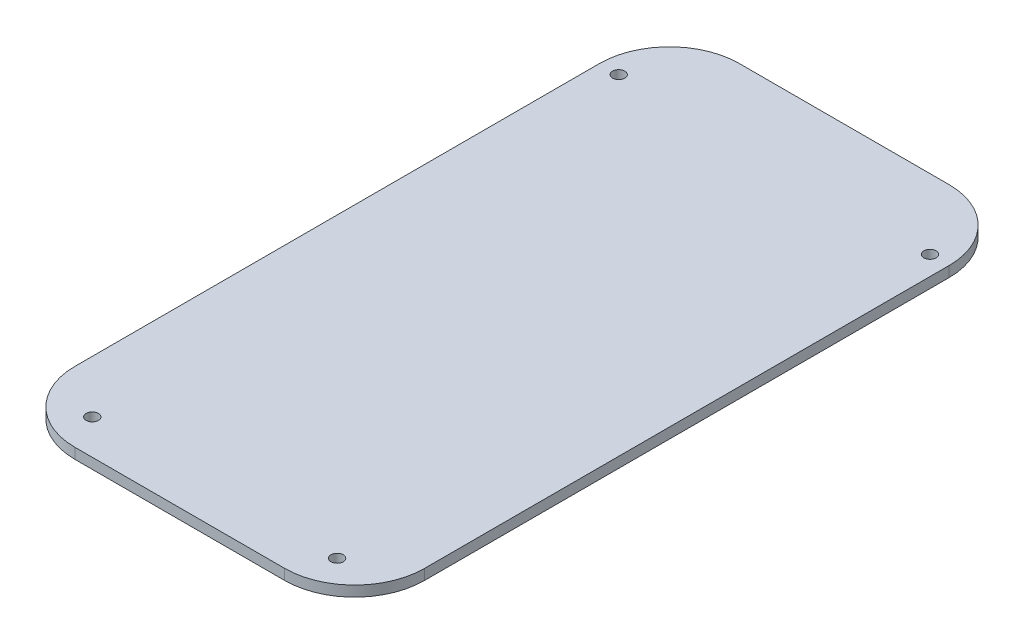
ISO-10303-21;
HEADER;
FILE_DESCRIPTION(('STEP AP214'),'2;1');
FILE_NAME('part.step','',(''),(''),'','','');
FILE_SCHEMA(('AUTOMOTIVE_DESIGN { 1 0 10303 214 1 1 1 1 }'));
ENDSEC;
DATA;
#1=APPLICATION_CONTEXT('core data for automotive mechanical design processes');
#2=APPLICATION_PROTOCOL_DEFINITION('international standard','automotive_design',2000,#1);
#3=PRODUCT_CONTEXT('',#1,'mechanical');
#4=PRODUCT('Part','Part','',(#3));
#5=PRODUCT_RELATED_PRODUCT_CATEGORY('part','',(#4));
#6=PRODUCT_DEFINITION_FORMATION('','',#4);
#7=PRODUCT_DEFINITION_CONTEXT('part definition',#1,'design');
#8=PRODUCT_DEFINITION('design','',#6,#7);
#9=PRODUCT_DEFINITION_SHAPE('','',#8);
#10=(LENGTH_UNIT() NAMED_UNIT(*) SI_UNIT(.MILLI.,.METRE.));
#11=(NAMED_UNIT(*) PLANE_ANGLE_UNIT() SI_UNIT($,.RADIAN.));
#12=(NAMED_UNIT(*) SI_UNIT($,.STERADIAN.) SOLID_ANGLE_UNIT());
#13=UNCERTAINTY_MEASURE_WITH_UNIT(LENGTH_MEASURE(1.E-05),#10,'distance_accuracy_value','');
#14=(GEOMETRIC_REPRESENTATION_CONTEXT(3) GLOBAL_UNCERTAINTY_ASSIGNED_CONTEXT((#13)) GLOBAL_UNIT_ASSIGNED_CONTEXT((#10,
#11,#12)) REPRESENTATION_CONTEXT('',''));
#15=CARTESIAN_POINT('',(0.,0.,0.));
#16=DIRECTION('',(0.,0.,1.));
#17=DIRECTION('',(1.,0.,0.));
#18=AXIS2_PLACEMENT_3D('',#15,#16,#17);
#19=CARTESIAN_POINT('',(20.,3.,-20.));
#20=DIRECTION('',(0.,-1.,0.));
#21=DIRECTION('',(0.,0.,-1.));
#22=AXIS2_PLACEMENT_3D('',#19,#20,#21);
#23=PLANE('',#22);
#24=CARTESIAN_POINT('',(20.,3.,-20.));
#25=DIRECTION('',(0.,1.,0.));
#26=DIRECTION('',(0.,0.,-1.));
#27=AXIS2_PLACEMENT_3D('',#24,#25,#26);
#28=CIRCLE('',#27,20.);
#29=CARTESIAN_POINT('',(0.,3.,-20.0000000000001));
#30=VERTEX_POINT('',#29);
#31=CARTESIAN_POINT('',(20.0000000000001,3.,0.));
#32=VERTEX_POINT('',#31);
#33=EDGE_CURVE('E164',#30,#32,#28,.T.);
#34=ORIENTED_EDGE('',*,*,#33,.T.);
#35=DIRECTION('',(1.,0.,0.));
#36=VECTOR('',#35,1.);
#37=CARTESIAN_POINT('',(20.0000000000001,3.,0.));
#38=LINE('',#37,#36);
#39=CARTESIAN_POINT('',(79.9999999999999,3.,0.));
#40=VERTEX_POINT('',#39);
#41=EDGE_CURVE('E100',#32,#40,#38,.T.);
#42=ORIENTED_EDGE('',*,*,#41,.T.);
#43=CARTESIAN_POINT('',(80.,3.,-20.));
#44=DIRECTION('',(0.,1.,0.));
#45=DIRECTION('',(0.,0.,1.));
#46=AXIS2_PLACEMENT_3D('',#43,#44,#45);
#47=CIRCLE('',#46,20.);
#48=CARTESIAN_POINT('',(100.,3.,-20.0000000000001));
#49=VERTEX_POINT('',#48);
#50=EDGE_CURVE('E185',#40,#49,#47,.T.);
#51=ORIENTED_EDGE('',*,*,#50,.T.);
#52=DIRECTION('',(0.,0.,-1.));
#53=VECTOR('',#52,1.);
#54=CARTESIAN_POINT('',(100.,3.,-20.0000000000001));
#55=LINE('',#54,#53);
#56=CARTESIAN_POINT('',(100.,3.,-170.));
#57=VERTEX_POINT('',#56);
#58=EDGE_CURVE('E199',#49,#57,#55,.T.);
#59=ORIENTED_EDGE('',*,*,#58,.T.);
#60=CARTESIAN_POINT('',(80.,3.,-170.));
#61=DIRECTION('',(0.,1.,0.));
#62=DIRECTION('',(0.,0.,1.));
#63=AXIS2_PLACEMENT_3D('',#60,#61,#62);
#64=CIRCLE('',#63,20.);
#65=CARTESIAN_POINT('',(79.9999999999999,3.,-190.));
#66=VERTEX_POINT('',#65);
#67=EDGE_CURVE('E119',#57,#66,#64,.T.);
#68=ORIENTED_EDGE('',*,*,#67,.T.);
#69=DIRECTION('',(-1.,0.,0.));
#70=VECTOR('',#69,1.);
#71=CARTESIAN_POINT('',(20.0000000000001,3.,-190.));
#72=LINE('',#71,#70);
#73=CARTESIAN_POINT('',(20.0000000000001,3.,-190.));
#74=VERTEX_POINT('',#73);
#75=EDGE_CURVE('E113',#66,#74,#72,.T.);
#76=ORIENTED_EDGE('',*,*,#75,.T.);
#77=CARTESIAN_POINT('',(20.,3.,-170.));
#78=DIRECTION('',(0.,1.,0.));
#79=DIRECTION('',(0.,0.,-1.));
#80=AXIS2_PLACEMENT_3D('',#77,#78,#79);
#81=CIRCLE('',#80,20.);
#82=CARTESIAN_POINT('',(0.,3.,-170.));
#83=VERTEX_POINT('',#82);
#84=EDGE_CURVE('E117',#74,#83,#81,.T.);
#85=ORIENTED_EDGE('',*,*,#84,.T.);
#86=DIRECTION('',(0.,0.,1.));
#87=VECTOR('',#86,1.);
#88=CARTESIAN_POINT('',(0.,3.,-20.0000000000001));
#89=LINE('',#88,#87);
#90=EDGE_CURVE('E57',#83,#30,#89,.T.);
#91=ORIENTED_EDGE('',*,*,#90,.T.);
#92=EDGE_LOOP('',(#34,#42,#51,#59,#68,#76,#85,#91));
#93=FACE_BOUND('',#92,.T.);
#94=CARTESIAN_POINT('',(5.49999999999999,3.,-170.));
#95=DIRECTION('',(0.,1.,0.));
#96=DIRECTION('',(0.,0.,1.));
#97=AXIS2_PLACEMENT_3D('',#94,#95,#96);
#98=CIRCLE('',#97,1.75);
#99=CARTESIAN_POINT('',(5.49999999999999,3.,-168.25));
#100=VERTEX_POINT('',#99);
#101=EDGE_CURVE('E146',#100,#100,#98,.T.);
#102=ORIENTED_EDGE('',*,*,#101,.F.);
#103=EDGE_LOOP('',(#102));
#104=FACE_BOUND('',#103,.T.);
#105=CARTESIAN_POINT('',(15.,3.,-10.));
#106=DIRECTION('',(0.,1.,0.));
#107=DIRECTION('',(0.,0.,1.));
#108=AXIS2_PLACEMENT_3D('',#105,#106,#107);
#109=CIRCLE('',#108,1.75);
#110=CARTESIAN_POINT('',(15.,3.,-8.25000000000001));
#111=VERTEX_POINT('',#110);
#112=EDGE_CURVE('E213',#111,#111,#109,.T.);
#113=ORIENTED_EDGE('',*,*,#112,.F.);
#114=EDGE_LOOP('',(#113));
#115=FACE_BOUND('',#114,.T.);
#116=CARTESIAN_POINT('',(85.,3.,-10.));
#117=DIRECTION('',(0.,1.,0.));
#118=DIRECTION('',(0.,0.,-1.));
#119=AXIS2_PLACEMENT_3D('',#116,#117,#118);
#120=CIRCLE('',#119,1.75);
#121=CARTESIAN_POINT('',(85.,3.,-11.75));
#122=VERTEX_POINT('',#121);
#123=EDGE_CURVE('E221',#122,#122,#120,.T.);
#124=ORIENTED_EDGE('',*,*,#123,.F.);
#125=EDGE_LOOP('',(#124));
#126=FACE_BOUND('',#125,.T.);
#127=CARTESIAN_POINT('',(94.5,3.,-170.));
#128=DIRECTION('',(0.,1.,0.));
#129=DIRECTION('',(0.,0.,-1.));
#130=AXIS2_PLACEMENT_3D('',#127,#128,#129);
#131=CIRCLE('',#130,1.75000000000001);
#132=CARTESIAN_POINT('',(94.5,3.,-171.75));
#133=VERTEX_POINT('',#132);
#134=EDGE_CURVE('E229',#133,#133,#131,.T.);
#135=ORIENTED_EDGE('',*,*,#134,.F.);
#136=EDGE_LOOP('',(#135));
#137=FACE_BOUND('',#136,.T.);
#138=ADVANCED_FACE('F39',(#93,#104,#115,#126,#137),#23,.F.);
#139=CARTESIAN_POINT('',(20.,0.,-20.));
#140=DIRECTION('',(0.,-1.,0.));
#141=DIRECTION('',(0.,0.,-1.));
#142=AXIS2_PLACEMENT_3D('',#139,#140,#141);
#143=PLANE('',#142);
#144=CARTESIAN_POINT('',(85.,0.,-10.));
#145=DIRECTION('',(0.,1.,0.));
#146=DIRECTION('',(0.,0.,-1.));
#147=AXIS2_PLACEMENT_3D('',#144,#145,#146);
#148=CIRCLE('',#147,1.75);
#149=CARTESIAN_POINT('',(85.,0.,-11.75));
#150=VERTEX_POINT('',#149);
#151=EDGE_CURVE('E225',#150,#150,#148,.T.);
#152=ORIENTED_EDGE('',*,*,#151,.T.);
#153=EDGE_LOOP('',(#152));
#154=FACE_BOUND('',#153,.T.);
#155=CARTESIAN_POINT('',(5.49999999999999,0.,-170.));
#156=DIRECTION('',(0.,1.,0.));
#157=DIRECTION('',(0.,0.,1.));
#158=AXIS2_PLACEMENT_3D('',#155,#156,#157);
#159=CIRCLE('',#158,1.75);
#160=CARTESIAN_POINT('',(5.49999999999999,0.,-168.25));
#161=VERTEX_POINT('',#160);
#162=EDGE_CURVE('E209',#161,#161,#159,.T.);
#163=ORIENTED_EDGE('',*,*,#162,.T.);
#164=EDGE_LOOP('',(#163));
#165=FACE_BOUND('',#164,.T.);
#166=CARTESIAN_POINT('',(20.,0.,-20.));
#167=DIRECTION('',(0.,1.,0.));
#168=DIRECTION('',(0.,0.,-1.));
#169=AXIS2_PLACEMENT_3D('',#166,#167,#168);
#170=CIRCLE('',#169,20.);
#171=CARTESIAN_POINT('',(0.,0.,-20.0000000000001));
#172=VERTEX_POINT('',#171);
#173=CARTESIAN_POINT('',(20.0000000000001,0.,0.));
#174=VERTEX_POINT('',#173);
#175=EDGE_CURVE('E141',#172,#174,#170,.T.);
#176=ORIENTED_EDGE('',*,*,#175,.F.);
#177=DIRECTION('',(0.,0.,1.));
#178=VECTOR('',#177,1.);
#179=CARTESIAN_POINT('',(0.,0.,-20.0000000000001));
#180=LINE('',#179,#178);
#181=CARTESIAN_POINT('',(0.,0.,-170.));
#182=VERTEX_POINT('',#181);
#183=EDGE_CURVE('E92',#182,#172,#180,.T.);
#184=ORIENTED_EDGE('',*,*,#183,.F.);
#185=CARTESIAN_POINT('',(20.,0.,-170.));
#186=DIRECTION('',(0.,1.,0.));
#187=DIRECTION('',(0.,0.,-1.));
#188=AXIS2_PLACEMENT_3D('',#185,#186,#187);
#189=CIRCLE('',#188,20.);
#190=CARTESIAN_POINT('',(20.0000000000001,0.,-190.));
#191=VERTEX_POINT('',#190);
#192=EDGE_CURVE('E86',#191,#182,#189,.T.);
#193=ORIENTED_EDGE('',*,*,#192,.F.);
#194=DIRECTION('',(-1.,0.,0.));
#195=VECTOR('',#194,1.);
#196=CARTESIAN_POINT('',(20.0000000000001,0.,-190.));
#197=LINE('',#196,#195);
#198=CARTESIAN_POINT('',(79.9999999999999,0.,-190.));
#199=VERTEX_POINT('',#198);
#200=EDGE_CURVE('E128',#199,#191,#197,.T.);
#201=ORIENTED_EDGE('',*,*,#200,.F.);
#202=CARTESIAN_POINT('',(80.,0.,-170.));
#203=DIRECTION('',(0.,1.,0.));
#204=DIRECTION('',(0.,0.,1.));
#205=AXIS2_PLACEMENT_3D('',#202,#203,#204);
#206=CIRCLE('',#205,20.);
#207=CARTESIAN_POINT('',(100.,0.,-170.));
#208=VERTEX_POINT('',#207);
#209=EDGE_CURVE('E155',#208,#199,#206,.T.);
#210=ORIENTED_EDGE('',*,*,#209,.F.);
#211=DIRECTION('',(0.,0.,-1.));
#212=VECTOR('',#211,1.);
#213=CARTESIAN_POINT('',(100.,0.,-20.0000000000001));
#214=LINE('',#213,#212);
#215=CARTESIAN_POINT('',(100.,0.,-20.0000000000001));
#216=VERTEX_POINT('',#215);
#217=EDGE_CURVE('E152',#216,#208,#214,.T.);
#218=ORIENTED_EDGE('',*,*,#217,.F.);
#219=CARTESIAN_POINT('',(80.,0.,-20.));
#220=DIRECTION('',(0.,1.,0.));
#221=DIRECTION('',(0.,0.,1.));
#222=AXIS2_PLACEMENT_3D('',#219,#220,#221);
#223=CIRCLE('',#222,20.);
#224=CARTESIAN_POINT('',(79.9999999999999,0.,0.));
#225=VERTEX_POINT('',#224);
#226=EDGE_CURVE('E149',#225,#216,#223,.T.);
#227=ORIENTED_EDGE('',*,*,#226,.F.);
#228=DIRECTION('',(1.,0.,0.));
#229=VECTOR('',#228,1.);
#230=CARTESIAN_POINT('',(20.0000000000001,0.,0.));
#231=LINE('',#230,#229);
#232=EDGE_CURVE('E145',#174,#225,#231,.T.);
#233=ORIENTED_EDGE('',*,*,#232,.F.);
#234=EDGE_LOOP('',(#176,#184,#193,#201,#210,#218,#227,#233));
#235=FACE_BOUND('',#234,.T.);
#236=CARTESIAN_POINT('',(15.,0.,-10.));
#237=DIRECTION('',(0.,1.,0.));
#238=DIRECTION('',(0.,0.,1.));
#239=AXIS2_PLACEMENT_3D('',#236,#237,#238);
#240=CIRCLE('',#239,1.75);
#241=CARTESIAN_POINT('',(15.,0.,-8.25000000000001));
#242=VERTEX_POINT('',#241);
#243=EDGE_CURVE('E217',#242,#242,#240,.T.);
#244=ORIENTED_EDGE('',*,*,#243,.T.);
#245=EDGE_LOOP('',(#244));
#246=FACE_BOUND('',#245,.T.);
#247=CARTESIAN_POINT('',(94.5,0.,-170.));
#248=DIRECTION('',(0.,1.,0.));
#249=DIRECTION('',(0.,0.,-1.));
#250=AXIS2_PLACEMENT_3D('',#247,#248,#249);
#251=CIRCLE('',#250,1.75000000000001);
#252=CARTESIAN_POINT('',(94.5,0.,-171.75));
#253=VERTEX_POINT('',#252);
#254=EDGE_CURVE('E233',#253,#253,#251,.T.);
#255=ORIENTED_EDGE('',*,*,#254,.T.);
#256=EDGE_LOOP('',(#255));
#257=FACE_BOUND('',#256,.T.);
#258=ADVANCED_FACE('F189',(#154,#165,#235,#246,#257),#143,.T.);
#259=CARTESIAN_POINT('',(20.,3.,-20.));
#260=DIRECTION('',(0.,-1.,0.));
#261=DIRECTION('',(0.,0.,-1.));
#262=AXIS2_PLACEMENT_3D('',#259,#260,#261);
#263=CYLINDRICAL_SURFACE('',#262,20.);
#264=ORIENTED_EDGE('',*,*,#175,.T.);
#265=DIRECTION('',(0.,-1.,0.));
#266=VECTOR('',#265,1.);
#267=CARTESIAN_POINT('',(20.0000000000001,3.,0.));
#268=LINE('',#267,#266);
#269=EDGE_CURVE('E11',#32,#174,#268,.T.);
#270=ORIENTED_EDGE('',*,*,#269,.F.);
#271=ORIENTED_EDGE('',*,*,#33,.F.);
#272=DIRECTION('',(0.,-1.,0.));
#273=VECTOR('',#272,1.);
#274=CARTESIAN_POINT('',(0.,3.,-20.0000000000001));
#275=LINE('',#274,#273);
#276=EDGE_CURVE('E137',#30,#172,#275,.T.);
#277=ORIENTED_EDGE('',*,*,#276,.T.);
#278=EDGE_LOOP('',(#264,#270,#271,#277));
#279=FACE_BOUND('',#278,.T.);
#280=ADVANCED_FACE('F41',(#279),#263,.T.);
#281=CARTESIAN_POINT('',(20.0000000000001,3.,0.));
#282=DIRECTION('',(0.,0.,-1.));
#283=DIRECTION('',(-1.,0.,0.));
#284=AXIS2_PLACEMENT_3D('',#281,#282,#283);
#285=PLANE('',#284);
#286=ORIENTED_EDGE('',*,*,#232,.T.);
#287=DIRECTION('',(0.,-1.,0.));
#288=VECTOR('',#287,1.);
#289=CARTESIAN_POINT('',(79.9999999999999,3.,0.));
#290=LINE('',#289,#288);
#291=EDGE_CURVE('E49',#40,#225,#290,.T.);
#292=ORIENTED_EDGE('',*,*,#291,.F.);
#293=ORIENTED_EDGE('',*,*,#41,.F.);
#294=ORIENTED_EDGE('',*,*,#269,.T.);
#295=EDGE_LOOP('',(#286,#292,#293,#294));
#296=FACE_BOUND('',#295,.T.);
#297=ADVANCED_FACE('F267',(#296),#285,.F.);
#298=CARTESIAN_POINT('',(80.,3.,-20.));
#299=DIRECTION('',(0.,-1.,0.));
#300=DIRECTION('',(0.,0.,-1.));
#301=AXIS2_PLACEMENT_3D('',#298,#299,#300);
#302=CYLINDRICAL_SURFACE('',#301,20.);
#303=ORIENTED_EDGE('',*,*,#226,.T.);
#304=DIRECTION('',(0.,-1.,0.));
#305=VECTOR('',#304,1.);
#306=CARTESIAN_POINT('',(100.,3.,-20.0000000000001));
#307=LINE('',#306,#305);
#308=EDGE_CURVE('E175',#49,#216,#307,.T.);
#309=ORIENTED_EDGE('',*,*,#308,.F.);
#310=ORIENTED_EDGE('',*,*,#50,.F.);
#311=ORIENTED_EDGE('',*,*,#291,.T.);
#312=EDGE_LOOP('',(#303,#309,#310,#311));
#313=FACE_BOUND('',#312,.T.);
#314=ADVANCED_FACE('F183',(#313),#302,.T.);
#315=CARTESIAN_POINT('',(100.,3.,-20.0000000000001));
#316=DIRECTION('',(-1.,0.,0.));
#317=DIRECTION('',(0.,0.,1.));
#318=AXIS2_PLACEMENT_3D('',#315,#316,#317);
#319=PLANE('',#318);
#320=ORIENTED_EDGE('',*,*,#217,.T.);
#321=DIRECTION('',(0.,-1.,0.));
#322=VECTOR('',#321,1.);
#323=CARTESIAN_POINT('',(100.,3.,-170.));
#324=LINE('',#323,#322);
#325=EDGE_CURVE('E171',#57,#208,#324,.T.);
#326=ORIENTED_EDGE('',*,*,#325,.F.);
#327=ORIENTED_EDGE('',*,*,#58,.F.);
#328=ORIENTED_EDGE('',*,*,#308,.T.);
#329=EDGE_LOOP('',(#320,#326,#327,#328));
#330=FACE_BOUND('',#329,.T.);
#331=ADVANCED_FACE('F194',(#330),#319,.F.);
#332=CARTESIAN_POINT('',(80.,3.,-170.));
#333=DIRECTION('',(0.,-1.,0.));
#334=DIRECTION('',(0.,0.,-1.));
#335=AXIS2_PLACEMENT_3D('',#332,#333,#334);
#336=CYLINDRICAL_SURFACE('',#335,20.);
#337=ORIENTED_EDGE('',*,*,#209,.T.);
#338=DIRECTION('',(0.,-1.,0.));
#339=VECTOR('',#338,1.);
#340=CARTESIAN_POINT('',(79.9999999999999,3.,-190.));
#341=LINE('',#340,#339);
#342=EDGE_CURVE('E130',#66,#199,#341,.T.);
#343=ORIENTED_EDGE('',*,*,#342,.F.);
#344=ORIENTED_EDGE('',*,*,#67,.F.);
#345=ORIENTED_EDGE('',*,*,#325,.T.);
#346=EDGE_LOOP('',(#337,#343,#344,#345));
#347=FACE_BOUND('',#346,.T.);
#348=ADVANCED_FACE('F197',(#347),#336,.T.);
#349=CARTESIAN_POINT('',(20.0000000000001,3.,-190.));
#350=DIRECTION('',(0.,0.,1.));
#351=DIRECTION('',(1.,0.,0.));
#352=AXIS2_PLACEMENT_3D('',#349,#350,#351);
#353=PLANE('',#352);
#354=ORIENTED_EDGE('',*,*,#200,.T.);
#355=DIRECTION('',(0.,-1.,0.));
#356=VECTOR('',#355,1.);
#357=CARTESIAN_POINT('',(20.0000000000001,3.,-190.));
#358=LINE('',#357,#356);
#359=EDGE_CURVE('E125',#74,#191,#358,.T.);
#360=ORIENTED_EDGE('',*,*,#359,.F.);
#361=ORIENTED_EDGE('',*,*,#75,.F.);
#362=ORIENTED_EDGE('',*,*,#342,.T.);
#363=EDGE_LOOP('',(#354,#360,#361,#362));
#364=FACE_BOUND('',#363,.T.);
#365=ADVANCED_FACE('F126',(#364),#353,.F.);
#366=CARTESIAN_POINT('',(20.,3.,-170.));
#367=DIRECTION('',(0.,-1.,0.));
#368=DIRECTION('',(0.,0.,-1.));
#369=AXIS2_PLACEMENT_3D('',#366,#367,#368);
#370=CYLINDRICAL_SURFACE('',#369,20.);
#371=ORIENTED_EDGE('',*,*,#192,.T.);
#372=DIRECTION('',(0.,-1.,0.));
#373=VECTOR('',#372,1.);
#374=CARTESIAN_POINT('',(0.,3.,-170.));
#375=LINE('',#374,#373);
#376=EDGE_CURVE('E131',#83,#182,#375,.T.);
#377=ORIENTED_EDGE('',*,*,#376,.F.);
#378=ORIENTED_EDGE('',*,*,#84,.F.);
#379=ORIENTED_EDGE('',*,*,#359,.T.);
#380=EDGE_LOOP('',(#371,#377,#378,#379));
#381=FACE_BOUND('',#380,.T.);
#382=ADVANCED_FACE('F133',(#381),#370,.T.);
#383=CARTESIAN_POINT('',(0.,3.,-20.0000000000001));
#384=DIRECTION('',(1.,0.,0.));
#385=DIRECTION('',(0.,0.,-1.));
#386=AXIS2_PLACEMENT_3D('',#383,#384,#385);
#387=PLANE('',#386);
#388=ORIENTED_EDGE('',*,*,#183,.T.);
#389=ORIENTED_EDGE('',*,*,#276,.F.);
#390=ORIENTED_EDGE('',*,*,#90,.F.);
#391=ORIENTED_EDGE('',*,*,#376,.T.);
#392=EDGE_LOOP('',(#388,#389,#390,#391));
#393=FACE_BOUND('',#392,.T.);
#394=ADVANCED_FACE('F255',(#393),#387,.F.);
#395=CARTESIAN_POINT('',(5.49999999999999,3.,-170.));
#396=DIRECTION('',(0.,-1.,0.));
#397=DIRECTION('',(0.,0.,-1.));
#398=AXIS2_PLACEMENT_3D('',#395,#396,#397);
#399=CYLINDRICAL_SURFACE('',#398,1.75);
#400=ORIENTED_EDGE('',*,*,#101,.T.);
#401=EDGE_LOOP('',(#400));
#402=FACE_BOUND('',#401,.T.);
#403=ORIENTED_EDGE('',*,*,#162,.F.);
#404=EDGE_LOOP('',(#403));
#405=FACE_BOUND('',#404,.T.);
#406=ADVANCED_FACE('F252',(#402,#405),#399,.F.);
#407=CARTESIAN_POINT('',(15.,3.,-10.));
#408=DIRECTION('',(0.,-1.,0.));
#409=DIRECTION('',(0.,0.,-1.));
#410=AXIS2_PLACEMENT_3D('',#407,#408,#409);
#411=CYLINDRICAL_SURFACE('',#410,1.75);
#412=ORIENTED_EDGE('',*,*,#112,.T.);
#413=EDGE_LOOP('',(#412));
#414=FACE_BOUND('',#413,.T.);
#415=ORIENTED_EDGE('',*,*,#243,.F.);
#416=EDGE_LOOP('',(#415));
#417=FACE_BOUND('',#416,.T.);
#418=ADVANCED_FACE('F331',(#414,#417),#411,.F.);
#419=CARTESIAN_POINT('',(85.,3.,-10.));
#420=DIRECTION('',(0.,-1.,0.));
#421=DIRECTION('',(0.,0.,-1.));
#422=AXIS2_PLACEMENT_3D('',#419,#420,#421);
#423=CYLINDRICAL_SURFACE('',#422,1.75);
#424=ORIENTED_EDGE('',*,*,#123,.T.);
#425=EDGE_LOOP('',(#424));
#426=FACE_BOUND('',#425,.T.);
#427=ORIENTED_EDGE('',*,*,#151,.F.);
#428=EDGE_LOOP('',(#427));
#429=FACE_BOUND('',#428,.T.);
#430=ADVANCED_FACE('F339',(#426,#429),#423,.F.);
#431=CARTESIAN_POINT('',(94.5,3.,-170.));
#432=DIRECTION('',(0.,-1.,0.));
#433=DIRECTION('',(0.,0.,-1.));
#434=AXIS2_PLACEMENT_3D('',#431,#432,#433);
#435=CYLINDRICAL_SURFACE('',#434,1.75000000000001);
#436=ORIENTED_EDGE('',*,*,#134,.T.);
#437=EDGE_LOOP('',(#436));
#438=FACE_BOUND('',#437,.T.);
#439=ORIENTED_EDGE('',*,*,#254,.F.);
#440=EDGE_LOOP('',(#439));
#441=FACE_BOUND('',#440,.T.);
#442=ADVANCED_FACE('F241',(#438,#441),#435,.F.);
#443=CLOSED_SHELL('',(#138,#258,#280,#297,#314,#331,#348,#365,#382,#394,#406,#418,#430,#442));
#444=MANIFOLD_SOLID_BREP('B2',#443);
#445=ADVANCED_BREP_SHAPE_REPRESENTATION('',(#18,#444),#14);
#446=SHAPE_DEFINITION_REPRESENTATION(#9,#445);
ENDSEC;
END-ISO-10303-21;
